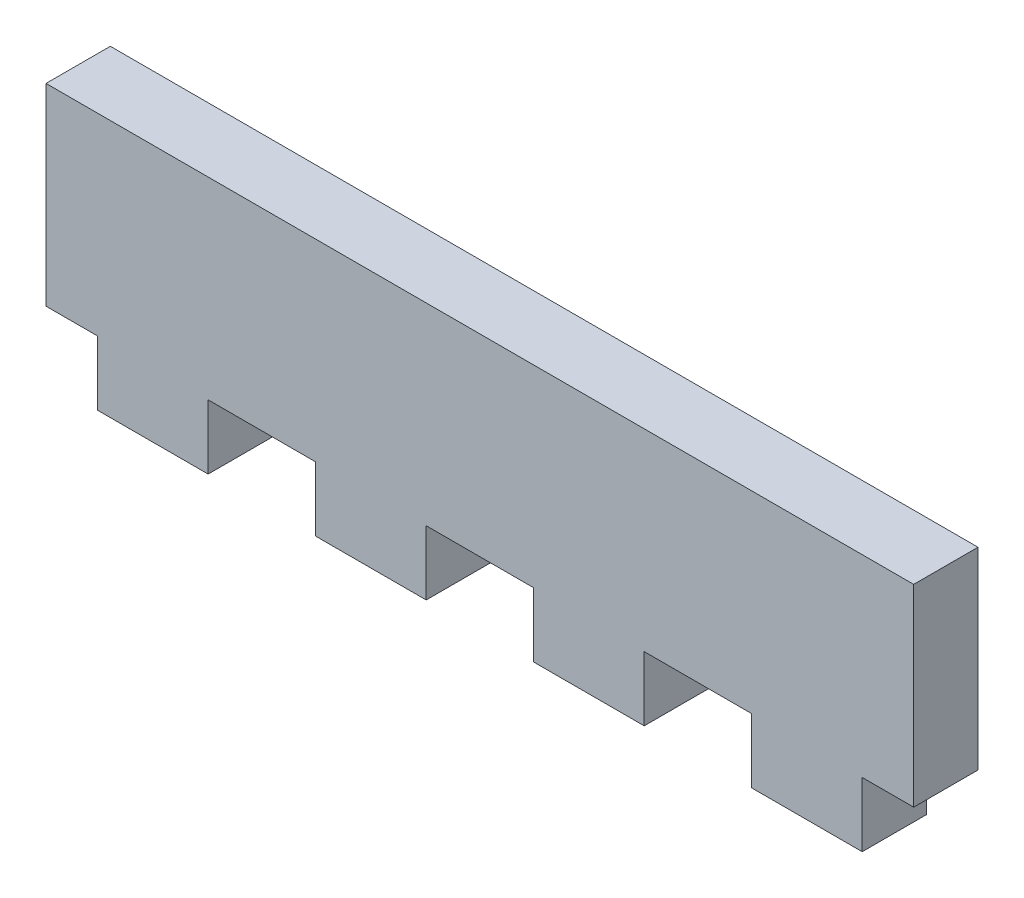
ISO-10303-21;
HEADER;
FILE_DESCRIPTION(('STEP AP214'),'2;1');
FILE_NAME('part.step','',(''),(''),'','','');
FILE_SCHEMA(('AUTOMOTIVE_DESIGN { 1 0 10303 214 1 1 1 1 }'));
ENDSEC;
DATA;
#1=APPLICATION_CONTEXT('core data for automotive mechanical design processes');
#2=APPLICATION_PROTOCOL_DEFINITION('international standard','automotive_design',2000,#1);
#3=PRODUCT_CONTEXT('',#1,'mechanical');
#4=PRODUCT('Part','Part','',(#3));
#5=PRODUCT_RELATED_PRODUCT_CATEGORY('part','',(#4));
#6=PRODUCT_DEFINITION_FORMATION('','',#4);
#7=PRODUCT_DEFINITION_CONTEXT('part definition',#1,'design');
#8=PRODUCT_DEFINITION('design','',#6,#7);
#9=PRODUCT_DEFINITION_SHAPE('','',#8);
#10=(LENGTH_UNIT() NAMED_UNIT(*) SI_UNIT(.MILLI.,.METRE.));
#11=(NAMED_UNIT(*) PLANE_ANGLE_UNIT() SI_UNIT($,.RADIAN.));
#12=(NAMED_UNIT(*) SI_UNIT($,.STERADIAN.) SOLID_ANGLE_UNIT());
#13=UNCERTAINTY_MEASURE_WITH_UNIT(LENGTH_MEASURE(1.E-05),#10,'distance_accuracy_value','');
#14=(GEOMETRIC_REPRESENTATION_CONTEXT(3) GLOBAL_UNCERTAINTY_ASSIGNED_CONTEXT((#13)) GLOBAL_UNIT_ASSIGNED_CONTEXT((#10,
#11,#12)) REPRESENTATION_CONTEXT('',''));
#15=CARTESIAN_POINT('',(0.,0.,0.));
#16=DIRECTION('',(0.,0.,1.));
#17=DIRECTION('',(1.,0.,0.));
#18=AXIS2_PLACEMENT_3D('',#15,#16,#17);
#19=CARTESIAN_POINT('',(5.73563581751116,29.8611746767434,5.));
#20=DIRECTION('',(-1.,0.,0.));
#21=DIRECTION('',(0.,0.,1.));
#22=AXIS2_PLACEMENT_3D('',#19,#20,#21);
#23=PLANE('',#22);
#24=DIRECTION('',(0.,1.,0.));
#25=VECTOR('',#24,1.);
#26=CARTESIAN_POINT('',(5.73563581751116,29.8611746767434,0.));
#27=LINE('',#26,#25);
#28=CARTESIAN_POINT('',(5.73563581751116,29.8611746767434,0.));
#29=VERTEX_POINT('',#28);
#30=CARTESIAN_POINT('',(5.73563581751116,34.8611746767434,0.));
#31=VERTEX_POINT('',#30);
#32=EDGE_CURVE('E200',#29,#31,#27,.T.);
#33=ORIENTED_EDGE('',*,*,#32,.T.);
#34=DIRECTION('',(0.,0.,-1.));
#35=VECTOR('',#34,1.);
#36=CARTESIAN_POINT('',(5.73563581751116,34.8611746767434,5.));
#37=LINE('',#36,#35);
#38=CARTESIAN_POINT('',(5.73563581751116,34.8611746767434,5.));
#39=VERTEX_POINT('',#38);
#40=EDGE_CURVE('E11',#39,#31,#37,.T.);
#41=ORIENTED_EDGE('',*,*,#40,.F.);
#42=DIRECTION('',(0.,1.,0.));
#43=VECTOR('',#42,1.);
#44=CARTESIAN_POINT('',(5.73563581751116,29.8611746767434,5.));
#45=LINE('',#44,#43);
#46=CARTESIAN_POINT('',(5.73563581751116,29.8611746767434,5.));
#47=VERTEX_POINT('',#46);
#48=EDGE_CURVE('E238',#47,#39,#45,.T.);
#49=ORIENTED_EDGE('',*,*,#48,.F.);
#50=DIRECTION('',(0.,0.,-1.));
#51=VECTOR('',#50,1.);
#52=CARTESIAN_POINT('',(5.73563581751116,29.8611746767434,5.));
#53=LINE('',#52,#51);
#54=EDGE_CURVE('E196',#47,#29,#53,.T.);
#55=ORIENTED_EDGE('',*,*,#54,.T.);
#56=EDGE_LOOP('',(#33,#41,#49,#55));
#57=FACE_BOUND('',#56,.T.);
#58=ADVANCED_FACE('F32',(#57),#23,.F.);
#59=CARTESIAN_POINT('',(5.73563581751116,34.8611746767434,5.));
#60=DIRECTION('',(0.,1.,0.));
#61=DIRECTION('',(0.,0.,1.));
#62=AXIS2_PLACEMENT_3D('',#59,#60,#61);
#63=PLANE('',#62);
#64=DIRECTION('',(1.,0.,0.));
#65=VECTOR('',#64,1.);
#66=CARTESIAN_POINT('',(5.73563581751116,34.8611746767434,0.));
#67=LINE('',#66,#65);
#68=CARTESIAN_POINT('',(14.0824358175112,34.8611746767434,0.));
#69=VERTEX_POINT('',#68);
#70=EDGE_CURVE('E203',#31,#69,#67,.T.);
#71=ORIENTED_EDGE('',*,*,#70,.T.);
#72=DIRECTION('',(0.,0.,-1.));
#73=VECTOR('',#72,1.);
#74=CARTESIAN_POINT('',(14.0824358175112,34.8611746767434,5.));
#75=LINE('',#74,#73);
#76=CARTESIAN_POINT('',(14.0824358175112,34.8611746767434,5.));
#77=VERTEX_POINT('',#76);
#78=EDGE_CURVE('E40',#77,#69,#75,.T.);
#79=ORIENTED_EDGE('',*,*,#78,.F.);
#80=DIRECTION('',(1.,0.,0.));
#81=VECTOR('',#80,1.);
#82=CARTESIAN_POINT('',(5.73563581751116,34.8611746767434,5.));
#83=LINE('',#82,#81);
#84=EDGE_CURVE('E127',#39,#77,#83,.T.);
#85=ORIENTED_EDGE('',*,*,#84,.F.);
#86=ORIENTED_EDGE('',*,*,#40,.T.);
#87=EDGE_LOOP('',(#71,#79,#85,#86));
#88=FACE_BOUND('',#87,.T.);
#89=ADVANCED_FACE('F356',(#88),#63,.F.);
#90=CARTESIAN_POINT('',(14.0824358175112,34.8611746767434,5.));
#91=DIRECTION('',(1.,0.,0.));
#92=DIRECTION('',(0.,0.,-1.));
#93=AXIS2_PLACEMENT_3D('',#90,#91,#92);
#94=PLANE('',#93);
#95=DIRECTION('',(0.,-1.,0.));
#96=VECTOR('',#95,1.);
#97=CARTESIAN_POINT('',(14.0824358175112,34.8611746767434,0.));
#98=LINE('',#97,#96);
#99=CARTESIAN_POINT('',(14.0824358175112,29.8611746767434,0.));
#100=VERTEX_POINT('',#99);
#101=EDGE_CURVE('E205',#69,#100,#98,.T.);
#102=ORIENTED_EDGE('',*,*,#101,.T.);
#103=DIRECTION('',(0.,0.,-1.));
#104=VECTOR('',#103,1.);
#105=CARTESIAN_POINT('',(14.0824358175112,29.8611746767434,5.));
#106=LINE('',#105,#104);
#107=CARTESIAN_POINT('',(14.0824358175112,29.8611746767434,5.));
#108=VERTEX_POINT('',#107);
#109=EDGE_CURVE('E281',#108,#100,#106,.T.);
#110=ORIENTED_EDGE('',*,*,#109,.F.);
#111=DIRECTION('',(0.,-1.,0.));
#112=VECTOR('',#111,1.);
#113=CARTESIAN_POINT('',(14.0824358175112,34.8611746767434,5.));
#114=LINE('',#113,#112);
#115=EDGE_CURVE('E289',#77,#108,#114,.T.);
#116=ORIENTED_EDGE('',*,*,#115,.F.);
#117=ORIENTED_EDGE('',*,*,#78,.T.);
#118=EDGE_LOOP('',(#102,#110,#116,#117));
#119=FACE_BOUND('',#118,.T.);
#120=ADVANCED_FACE('F287',(#119),#94,.F.);
#121=CARTESIAN_POINT('',(22.6831358175112,29.8611746767434,5.));
#122=DIRECTION('',(0.,1.,0.));
#123=DIRECTION('',(0.,0.,1.));
#124=AXIS2_PLACEMENT_3D('',#121,#122,#123);
#125=PLANE('',#124);
#126=DIRECTION('',(1.,0.,0.));
#127=VECTOR('',#126,1.);
#128=CARTESIAN_POINT('',(22.6831358175112,29.8611746767434,0.));
#129=LINE('',#128,#127);
#130=CARTESIAN_POINT('',(22.6831358175112,29.8611746767434,0.));
#131=VERTEX_POINT('',#130);
#132=EDGE_CURVE('E207',#100,#131,#129,.T.);
#133=ORIENTED_EDGE('',*,*,#132,.T.);
#134=DIRECTION('',(0.,0.,-1.));
#135=VECTOR('',#134,1.);
#136=CARTESIAN_POINT('',(22.6831358175112,29.8611746767434,5.));
#137=LINE('',#136,#135);
#138=CARTESIAN_POINT('',(22.6831358175112,29.8611746767434,5.));
#139=VERTEX_POINT('',#138);
#140=EDGE_CURVE('E278',#139,#131,#137,.T.);
#141=ORIENTED_EDGE('',*,*,#140,.F.);
#142=DIRECTION('',(1.,0.,0.));
#143=VECTOR('',#142,1.);
#144=CARTESIAN_POINT('',(22.6831358175112,29.8611746767434,5.));
#145=LINE('',#144,#143);
#146=EDGE_CURVE('E307',#108,#139,#145,.T.);
#147=ORIENTED_EDGE('',*,*,#146,.F.);
#148=ORIENTED_EDGE('',*,*,#109,.T.);
#149=EDGE_LOOP('',(#133,#141,#147,#148));
#150=FACE_BOUND('',#149,.T.);
#151=ADVANCED_FACE('F298',(#150),#125,.F.);
#152=CARTESIAN_POINT('',(22.6831358175112,29.8611746767434,5.));
#153=DIRECTION('',(-1.,0.,0.));
#154=DIRECTION('',(0.,0.,1.));
#155=AXIS2_PLACEMENT_3D('',#152,#153,#154);
#156=PLANE('',#155);
#157=DIRECTION('',(0.,1.,0.));
#158=VECTOR('',#157,1.);
#159=CARTESIAN_POINT('',(22.6831358175112,29.8611746767434,0.));
#160=LINE('',#159,#158);
#161=CARTESIAN_POINT('',(22.6831358175112,34.8611746767434,0.));
#162=VERTEX_POINT('',#161);
#163=EDGE_CURVE('E209',#131,#162,#160,.T.);
#164=ORIENTED_EDGE('',*,*,#163,.T.);
#165=DIRECTION('',(0.,0.,-1.));
#166=VECTOR('',#165,1.);
#167=CARTESIAN_POINT('',(22.6831358175112,34.8611746767434,5.));
#168=LINE('',#167,#166);
#169=CARTESIAN_POINT('',(22.6831358175112,34.8611746767434,5.));
#170=VERTEX_POINT('',#169);
#171=EDGE_CURVE('E275',#170,#162,#168,.T.);
#172=ORIENTED_EDGE('',*,*,#171,.F.);
#173=DIRECTION('',(0.,1.,0.));
#174=VECTOR('',#173,1.);
#175=CARTESIAN_POINT('',(22.6831358175112,29.8611746767434,5.));
#176=LINE('',#175,#174);
#177=EDGE_CURVE('E304',#139,#170,#176,.T.);
#178=ORIENTED_EDGE('',*,*,#177,.F.);
#179=ORIENTED_EDGE('',*,*,#140,.T.);
#180=EDGE_LOOP('',(#164,#172,#178,#179));
#181=FACE_BOUND('',#180,.T.);
#182=ADVANCED_FACE('F302',(#181),#156,.F.);
#183=CARTESIAN_POINT('',(22.6831358175112,34.8611746767434,5.));
#184=DIRECTION('',(0.,1.,0.));
#185=DIRECTION('',(0.,0.,1.));
#186=AXIS2_PLACEMENT_3D('',#183,#184,#185);
#187=PLANE('',#186);
#188=DIRECTION('',(1.,0.,0.));
#189=VECTOR('',#188,1.);
#190=CARTESIAN_POINT('',(22.6831358175112,34.8611746767434,0.));
#191=LINE('',#190,#189);
#192=CARTESIAN_POINT('',(26.6831358175112,34.8611746767434,0.));
#193=VERTEX_POINT('',#192);
#194=EDGE_CURVE('E211',#162,#193,#191,.T.);
#195=ORIENTED_EDGE('',*,*,#194,.T.);
#196=DIRECTION('',(0.,0.,-1.));
#197=VECTOR('',#196,1.);
#198=CARTESIAN_POINT('',(26.6831358175112,34.8611746767434,5.));
#199=LINE('',#198,#197);
#200=CARTESIAN_POINT('',(26.6831358175112,34.8611746767434,5.));
#201=VERTEX_POINT('',#200);
#202=EDGE_CURVE('E272',#201,#193,#199,.T.);
#203=ORIENTED_EDGE('',*,*,#202,.F.);
#204=DIRECTION('',(1.,0.,0.));
#205=VECTOR('',#204,1.);
#206=CARTESIAN_POINT('',(22.6831358175112,34.8611746767434,5.));
#207=LINE('',#206,#205);
#208=EDGE_CURVE('E306',#170,#201,#207,.T.);
#209=ORIENTED_EDGE('',*,*,#208,.F.);
#210=ORIENTED_EDGE('',*,*,#171,.T.);
#211=EDGE_LOOP('',(#195,#203,#209,#210));
#212=FACE_BOUND('',#211,.T.);
#213=ADVANCED_FACE('F369',(#212),#187,.F.);
#214=CARTESIAN_POINT('',(26.6831358175112,34.8611746767434,5.));
#215=DIRECTION('',(-1.,0.,0.));
#216=DIRECTION('',(0.,0.,1.));
#217=AXIS2_PLACEMENT_3D('',#214,#215,#216);
#218=PLANE('',#217);
#219=DIRECTION('',(0.,1.,0.));
#220=VECTOR('',#219,1.);
#221=CARTESIAN_POINT('',(26.6831358175112,34.8611746767434,0.));
#222=LINE('',#221,#220);
#223=CARTESIAN_POINT('',(26.6831358175112,49.8611746767434,0.));
#224=VERTEX_POINT('',#223);
#225=EDGE_CURVE('E213',#193,#224,#222,.T.);
#226=ORIENTED_EDGE('',*,*,#225,.T.);
#227=DIRECTION('',(0.,0.,-1.));
#228=VECTOR('',#227,1.);
#229=CARTESIAN_POINT('',(26.6831358175112,49.8611746767434,5.));
#230=LINE('',#229,#228);
#231=CARTESIAN_POINT('',(26.6831358175112,49.8611746767434,5.));
#232=VERTEX_POINT('',#231);
#233=EDGE_CURVE('E269',#232,#224,#230,.T.);
#234=ORIENTED_EDGE('',*,*,#233,.F.);
#235=DIRECTION('',(0.,1.,0.));
#236=VECTOR('',#235,1.);
#237=CARTESIAN_POINT('',(26.6831358175112,34.8611746767434,5.));
#238=LINE('',#237,#236);
#239=EDGE_CURVE('E309',#201,#232,#238,.T.);
#240=ORIENTED_EDGE('',*,*,#239,.F.);
#241=ORIENTED_EDGE('',*,*,#202,.T.);
#242=EDGE_LOOP('',(#226,#234,#240,#241));
#243=FACE_BOUND('',#242,.T.);
#244=ADVANCED_FACE('F372',(#243),#218,.F.);
#245=CARTESIAN_POINT('',(26.6831358175112,49.8611746767434,5.));
#246=DIRECTION('',(0.,-1.,0.));
#247=DIRECTION('',(1.,0.,0.));
#248=AXIS2_PLACEMENT_3D('',#245,#246,#247);
#249=PLANE('',#248);
#250=DIRECTION('',(-1.,0.,0.));
#251=VECTOR('',#250,1.);
#252=CARTESIAN_POINT('',(26.6831358175112,49.8611746767434,0.));
#253=LINE('',#252,#251);
#254=CARTESIAN_POINT('',(-40.7670641824889,49.8611746767434,0.));
#255=VERTEX_POINT('',#254);
#256=EDGE_CURVE('E215',#224,#255,#253,.T.);
#257=ORIENTED_EDGE('',*,*,#256,.T.);
#258=DIRECTION('',(0.,0.,-1.));
#259=VECTOR('',#258,1.);
#260=CARTESIAN_POINT('',(-40.7670641824889,49.8611746767434,5.));
#261=LINE('',#260,#259);
#262=CARTESIAN_POINT('',(-40.7670641824889,49.8611746767434,5.));
#263=VERTEX_POINT('',#262);
#264=EDGE_CURVE('E266',#263,#255,#261,.T.);
#265=ORIENTED_EDGE('',*,*,#264,.F.);
#266=DIRECTION('',(-1.,0.,0.));
#267=VECTOR('',#266,1.);
#268=CARTESIAN_POINT('',(26.6831358175112,49.8611746767434,5.));
#269=LINE('',#268,#267);
#270=EDGE_CURVE('E315',#232,#263,#269,.T.);
#271=ORIENTED_EDGE('',*,*,#270,.F.);
#272=ORIENTED_EDGE('',*,*,#233,.T.);
#273=EDGE_LOOP('',(#257,#265,#271,#272));
#274=FACE_BOUND('',#273,.T.);
#275=ADVANCED_FACE('F376',(#274),#249,.F.);
#276=CARTESIAN_POINT('',(-40.7670641824889,34.8611746767434,5.));
#277=DIRECTION('',(1.,0.,0.));
#278=DIRECTION('',(0.,0.,-1.));
#279=AXIS2_PLACEMENT_3D('',#276,#277,#278);
#280=PLANE('',#279);
#281=DIRECTION('',(0.,-1.,0.));
#282=VECTOR('',#281,1.);
#283=CARTESIAN_POINT('',(-40.7670641824889,34.8611746767434,0.));
#284=LINE('',#283,#282);
#285=CARTESIAN_POINT('',(-40.7670641824889,34.8611746767434,0.));
#286=VERTEX_POINT('',#285);
#287=EDGE_CURVE('E217',#255,#286,#284,.T.);
#288=ORIENTED_EDGE('',*,*,#287,.T.);
#289=DIRECTION('',(0.,0.,-1.));
#290=VECTOR('',#289,1.);
#291=CARTESIAN_POINT('',(-40.7670641824889,34.8611746767434,5.));
#292=LINE('',#291,#290);
#293=CARTESIAN_POINT('',(-40.7670641824889,34.8611746767434,5.));
#294=VERTEX_POINT('',#293);
#295=EDGE_CURVE('E263',#294,#286,#292,.T.);
#296=ORIENTED_EDGE('',*,*,#295,.F.);
#297=DIRECTION('',(0.,-1.,0.));
#298=VECTOR('',#297,1.);
#299=CARTESIAN_POINT('',(-40.7670641824889,34.8611746767434,5.));
#300=LINE('',#299,#298);
#301=EDGE_CURVE('E317',#263,#294,#300,.T.);
#302=ORIENTED_EDGE('',*,*,#301,.F.);
#303=ORIENTED_EDGE('',*,*,#264,.T.);
#304=EDGE_LOOP('',(#288,#296,#302,#303));
#305=FACE_BOUND('',#304,.T.);
#306=ADVANCED_FACE('F380',(#305),#280,.F.);
#307=CARTESIAN_POINT('',(-36.7670641824889,34.8611746767434,5.));
#308=DIRECTION('',(0.,1.,0.));
#309=DIRECTION('',(0.,0.,1.));
#310=AXIS2_PLACEMENT_3D('',#307,#308,#309);
#311=PLANE('',#310);
#312=DIRECTION('',(1.,0.,0.));
#313=VECTOR('',#312,1.);
#314=CARTESIAN_POINT('',(-36.7670641824889,34.8611746767434,0.));
#315=LINE('',#314,#313);
#316=CARTESIAN_POINT('',(-36.7670641824889,34.8611746767434,0.));
#317=VERTEX_POINT('',#316);
#318=EDGE_CURVE('E219',#286,#317,#315,.T.);
#319=ORIENTED_EDGE('',*,*,#318,.T.);
#320=DIRECTION('',(0.,0.,-1.));
#321=VECTOR('',#320,1.);
#322=CARTESIAN_POINT('',(-36.7670641824889,34.8611746767434,5.));
#323=LINE('',#322,#321);
#324=CARTESIAN_POINT('',(-36.7670641824889,34.8611746767434,5.));
#325=VERTEX_POINT('',#324);
#326=EDGE_CURVE('E260',#325,#317,#323,.T.);
#327=ORIENTED_EDGE('',*,*,#326,.F.);
#328=DIRECTION('',(1.,0.,0.));
#329=VECTOR('',#328,1.);
#330=CARTESIAN_POINT('',(-36.7670641824889,34.8611746767434,5.));
#331=LINE('',#330,#329);
#332=EDGE_CURVE('E319',#294,#325,#331,.T.);
#333=ORIENTED_EDGE('',*,*,#332,.F.);
#334=ORIENTED_EDGE('',*,*,#295,.T.);
#335=EDGE_LOOP('',(#319,#327,#333,#334));
#336=FACE_BOUND('',#335,.T.);
#337=ADVANCED_FACE('F384',(#336),#311,.F.);
#338=CARTESIAN_POINT('',(-36.7670641824889,29.8611746767434,5.));
#339=DIRECTION('',(1.,0.,0.));
#340=DIRECTION('',(0.,0.,-1.));
#341=AXIS2_PLACEMENT_3D('',#338,#339,#340);
#342=PLANE('',#341);
#343=DIRECTION('',(0.,-1.,0.));
#344=VECTOR('',#343,1.);
#345=CARTESIAN_POINT('',(-36.7670641824889,29.8611746767434,0.));
#346=LINE('',#345,#344);
#347=CARTESIAN_POINT('',(-36.7670641824889,29.8611746767434,0.));
#348=VERTEX_POINT('',#347);
#349=EDGE_CURVE('E221',#317,#348,#346,.T.);
#350=ORIENTED_EDGE('',*,*,#349,.T.);
#351=DIRECTION('',(0.,0.,-1.));
#352=VECTOR('',#351,1.);
#353=CARTESIAN_POINT('',(-36.7670641824889,29.8611746767434,5.));
#354=LINE('',#353,#352);
#355=CARTESIAN_POINT('',(-36.7670641824889,29.8611746767434,5.));
#356=VERTEX_POINT('',#355);
#357=EDGE_CURVE('E257',#356,#348,#354,.T.);
#358=ORIENTED_EDGE('',*,*,#357,.F.);
#359=DIRECTION('',(0.,-1.,0.));
#360=VECTOR('',#359,1.);
#361=CARTESIAN_POINT('',(-36.7670641824889,29.8611746767434,5.));
#362=LINE('',#361,#360);
#363=EDGE_CURVE('E321',#325,#356,#362,.T.);
#364=ORIENTED_EDGE('',*,*,#363,.F.);
#365=ORIENTED_EDGE('',*,*,#326,.T.);
#366=EDGE_LOOP('',(#350,#358,#364,#365));
#367=FACE_BOUND('',#366,.T.);
#368=ADVANCED_FACE('F388',(#367),#342,.F.);
#369=CARTESIAN_POINT('',(-28.1627641824889,29.8611746767434,5.));
#370=DIRECTION('',(0.,1.,0.));
#371=DIRECTION('',(0.,0.,1.));
#372=AXIS2_PLACEMENT_3D('',#369,#370,#371);
#373=PLANE('',#372);
#374=DIRECTION('',(1.,0.,0.));
#375=VECTOR('',#374,1.);
#376=CARTESIAN_POINT('',(-28.1627641824889,29.8611746767434,0.));
#377=LINE('',#376,#375);
#378=CARTESIAN_POINT('',(-28.1627641824889,29.8611746767434,0.));
#379=VERTEX_POINT('',#378);
#380=EDGE_CURVE('E223',#348,#379,#377,.T.);
#381=ORIENTED_EDGE('',*,*,#380,.T.);
#382=DIRECTION('',(0.,0.,-1.));
#383=VECTOR('',#382,1.);
#384=CARTESIAN_POINT('',(-28.1627641824889,29.8611746767434,5.));
#385=LINE('',#384,#383);
#386=CARTESIAN_POINT('',(-28.1627641824889,29.8611746767434,5.));
#387=VERTEX_POINT('',#386);
#388=EDGE_CURVE('E254',#387,#379,#385,.T.);
#389=ORIENTED_EDGE('',*,*,#388,.F.);
#390=DIRECTION('',(1.,0.,0.));
#391=VECTOR('',#390,1.);
#392=CARTESIAN_POINT('',(-28.1627641824889,29.8611746767434,5.));
#393=LINE('',#392,#391);
#394=EDGE_CURVE('E323',#356,#387,#393,.T.);
#395=ORIENTED_EDGE('',*,*,#394,.F.);
#396=ORIENTED_EDGE('',*,*,#357,.T.);
#397=EDGE_LOOP('',(#381,#389,#395,#396));
#398=FACE_BOUND('',#397,.T.);
#399=ADVANCED_FACE('F392',(#398),#373,.F.);
#400=CARTESIAN_POINT('',(-28.1627641824889,29.8611746767434,5.));
#401=DIRECTION('',(-1.,0.,0.));
#402=DIRECTION('',(0.,0.,1.));
#403=AXIS2_PLACEMENT_3D('',#400,#401,#402);
#404=PLANE('',#403);
#405=DIRECTION('',(0.,1.,0.));
#406=VECTOR('',#405,1.);
#407=CARTESIAN_POINT('',(-28.1627641824889,29.8611746767434,0.));
#408=LINE('',#407,#406);
#409=CARTESIAN_POINT('',(-28.1627641824889,34.8611746767434,0.));
#410=VERTEX_POINT('',#409);
#411=EDGE_CURVE('E225',#379,#410,#408,.T.);
#412=ORIENTED_EDGE('',*,*,#411,.T.);
#413=DIRECTION('',(0.,0.,-1.));
#414=VECTOR('',#413,1.);
#415=CARTESIAN_POINT('',(-28.1627641824889,34.8611746767434,5.));
#416=LINE('',#415,#414);
#417=CARTESIAN_POINT('',(-28.1627641824889,34.8611746767434,5.));
#418=VERTEX_POINT('',#417);
#419=EDGE_CURVE('E251',#418,#410,#416,.T.);
#420=ORIENTED_EDGE('',*,*,#419,.F.);
#421=DIRECTION('',(0.,1.,0.));
#422=VECTOR('',#421,1.);
#423=CARTESIAN_POINT('',(-28.1627641824889,29.8611746767434,5.));
#424=LINE('',#423,#422);
#425=EDGE_CURVE('E325',#387,#418,#424,.T.);
#426=ORIENTED_EDGE('',*,*,#425,.F.);
#427=ORIENTED_EDGE('',*,*,#388,.T.);
#428=EDGE_LOOP('',(#412,#420,#426,#427));
#429=FACE_BOUND('',#428,.T.);
#430=ADVANCED_FACE('F396',(#429),#404,.F.);
#431=CARTESIAN_POINT('',(-19.8160641824889,34.8611746767434,5.));
#432=DIRECTION('',(0.,1.,0.));
#433=DIRECTION('',(0.,0.,1.));
#434=AXIS2_PLACEMENT_3D('',#431,#432,#433);
#435=PLANE('',#434);
#436=DIRECTION('',(1.,0.,0.));
#437=VECTOR('',#436,1.);
#438=CARTESIAN_POINT('',(-19.8160641824889,34.8611746767434,0.));
#439=LINE('',#438,#437);
#440=CARTESIAN_POINT('',(-19.8160641824889,34.8611746767434,0.));
#441=VERTEX_POINT('',#440);
#442=EDGE_CURVE('E227',#410,#441,#439,.T.);
#443=ORIENTED_EDGE('',*,*,#442,.T.);
#444=DIRECTION('',(0.,0.,-1.));
#445=VECTOR('',#444,1.);
#446=CARTESIAN_POINT('',(-19.8160641824889,34.8611746767434,5.));
#447=LINE('',#446,#445);
#448=CARTESIAN_POINT('',(-19.8160641824889,34.8611746767434,5.));
#449=VERTEX_POINT('',#448);
#450=EDGE_CURVE('E248',#449,#441,#447,.T.);
#451=ORIENTED_EDGE('',*,*,#450,.F.);
#452=DIRECTION('',(1.,0.,0.));
#453=VECTOR('',#452,1.);
#454=CARTESIAN_POINT('',(-19.8160641824889,34.8611746767434,5.));
#455=LINE('',#454,#453);
#456=EDGE_CURVE('E327',#418,#449,#455,.T.);
#457=ORIENTED_EDGE('',*,*,#456,.F.);
#458=ORIENTED_EDGE('',*,*,#419,.T.);
#459=EDGE_LOOP('',(#443,#451,#457,#458));
#460=FACE_BOUND('',#459,.T.);
#461=ADVANCED_FACE('F400',(#460),#435,.F.);
#462=CARTESIAN_POINT('',(-19.8160641824889,29.8611746767434,5.));
#463=DIRECTION('',(1.,0.,0.));
#464=DIRECTION('',(0.,0.,-1.));
#465=AXIS2_PLACEMENT_3D('',#462,#463,#464);
#466=PLANE('',#465);
#467=DIRECTION('',(0.,-1.,0.));
#468=VECTOR('',#467,1.);
#469=CARTESIAN_POINT('',(-19.8160641824889,29.8611746767434,0.));
#470=LINE('',#469,#468);
#471=CARTESIAN_POINT('',(-19.8160641824889,29.8611746767434,0.));
#472=VERTEX_POINT('',#471);
#473=EDGE_CURVE('E229',#441,#472,#470,.T.);
#474=ORIENTED_EDGE('',*,*,#473,.T.);
#475=DIRECTION('',(0.,0.,-1.));
#476=VECTOR('',#475,1.);
#477=CARTESIAN_POINT('',(-19.8160641824889,29.8611746767434,5.));
#478=LINE('',#477,#476);
#479=CARTESIAN_POINT('',(-19.8160641824889,29.8611746767434,5.));
#480=VERTEX_POINT('',#479);
#481=EDGE_CURVE('E245',#480,#472,#478,.T.);
#482=ORIENTED_EDGE('',*,*,#481,.F.);
#483=DIRECTION('',(0.,-1.,0.));
#484=VECTOR('',#483,1.);
#485=CARTESIAN_POINT('',(-19.8160641824889,29.8611746767434,5.));
#486=LINE('',#485,#484);
#487=EDGE_CURVE('E329',#449,#480,#486,.T.);
#488=ORIENTED_EDGE('',*,*,#487,.F.);
#489=ORIENTED_EDGE('',*,*,#450,.T.);
#490=EDGE_LOOP('',(#474,#482,#488,#489));
#491=FACE_BOUND('',#490,.T.);
#492=ADVANCED_FACE('F404',(#491),#466,.F.);
#493=CARTESIAN_POINT('',(-11.2118641824889,29.8611746767434,5.));
#494=DIRECTION('',(0.,1.,0.));
#495=DIRECTION('',(0.,0.,1.));
#496=AXIS2_PLACEMENT_3D('',#493,#494,#495);
#497=PLANE('',#496);
#498=DIRECTION('',(1.,0.,0.));
#499=VECTOR('',#498,1.);
#500=CARTESIAN_POINT('',(-11.2118641824889,29.8611746767434,0.));
#501=LINE('',#500,#499);
#502=CARTESIAN_POINT('',(-11.2118641824889,29.8611746767434,0.));
#503=VERTEX_POINT('',#502);
#504=EDGE_CURVE('E231',#472,#503,#501,.T.);
#505=ORIENTED_EDGE('',*,*,#504,.T.);
#506=DIRECTION('',(0.,0.,-1.));
#507=VECTOR('',#506,1.);
#508=CARTESIAN_POINT('',(-11.2118641824889,29.8611746767434,5.));
#509=LINE('',#508,#507);
#510=CARTESIAN_POINT('',(-11.2118641824889,29.8611746767434,5.));
#511=VERTEX_POINT('',#510);
#512=EDGE_CURVE('E242',#511,#503,#509,.T.);
#513=ORIENTED_EDGE('',*,*,#512,.F.);
#514=DIRECTION('',(1.,0.,0.));
#515=VECTOR('',#514,1.);
#516=CARTESIAN_POINT('',(-11.2118641824889,29.8611746767434,5.));
#517=LINE('',#516,#515);
#518=EDGE_CURVE('E331',#480,#511,#517,.T.);
#519=ORIENTED_EDGE('',*,*,#518,.F.);
#520=ORIENTED_EDGE('',*,*,#481,.T.);
#521=EDGE_LOOP('',(#505,#513,#519,#520));
#522=FACE_BOUND('',#521,.T.);
#523=ADVANCED_FACE('F337',(#522),#497,.F.);
#524=CARTESIAN_POINT('',(-11.2118641824889,29.8611746767434,5.));
#525=DIRECTION('',(-1.,0.,0.));
#526=DIRECTION('',(0.,0.,1.));
#527=AXIS2_PLACEMENT_3D('',#524,#525,#526);
#528=PLANE('',#527);
#529=DIRECTION('',(0.,1.,0.));
#530=VECTOR('',#529,1.);
#531=CARTESIAN_POINT('',(-11.2118641824889,29.8611746767434,0.));
#532=LINE('',#531,#530);
#533=CARTESIAN_POINT('',(-11.2118641824889,34.8611746767434,0.));
#534=VERTEX_POINT('',#533);
#535=EDGE_CURVE('E233',#503,#534,#532,.T.);
#536=ORIENTED_EDGE('',*,*,#535,.T.);
#537=DIRECTION('',(0.,0.,-1.));
#538=VECTOR('',#537,1.);
#539=CARTESIAN_POINT('',(-11.2118641824889,34.8611746767434,5.));
#540=LINE('',#539,#538);
#541=CARTESIAN_POINT('',(-11.2118641824889,34.8611746767434,5.));
#542=VERTEX_POINT('',#541);
#543=EDGE_CURVE('E191',#542,#534,#540,.T.);
#544=ORIENTED_EDGE('',*,*,#543,.F.);
#545=DIRECTION('',(0.,1.,0.));
#546=VECTOR('',#545,1.);
#547=CARTESIAN_POINT('',(-11.2118641824889,29.8611746767434,5.));
#548=LINE('',#547,#546);
#549=EDGE_CURVE('E182',#511,#542,#548,.T.);
#550=ORIENTED_EDGE('',*,*,#549,.F.);
#551=ORIENTED_EDGE('',*,*,#512,.T.);
#552=EDGE_LOOP('',(#536,#544,#550,#551));
#553=FACE_BOUND('',#552,.T.);
#554=ADVANCED_FACE('F341',(#553),#528,.F.);
#555=CARTESIAN_POINT('',(-11.2118641824889,34.8611746767434,5.));
#556=DIRECTION('',(0.,1.,0.));
#557=DIRECTION('',(0.,0.,1.));
#558=AXIS2_PLACEMENT_3D('',#555,#556,#557);
#559=PLANE('',#558);
#560=DIRECTION('',(1.,0.,0.));
#561=VECTOR('',#560,1.);
#562=CARTESIAN_POINT('',(-11.2118641824889,34.8611746767434,0.));
#563=LINE('',#562,#561);
#564=CARTESIAN_POINT('',(-2.86506418248886,34.8611746767434,0.));
#565=VERTEX_POINT('',#564);
#566=EDGE_CURVE('E190',#534,#565,#563,.T.);
#567=ORIENTED_EDGE('',*,*,#566,.T.);
#568=DIRECTION('',(0.,0.,-1.));
#569=VECTOR('',#568,1.);
#570=CARTESIAN_POINT('',(-2.86506418248886,34.8611746767434,5.));
#571=LINE('',#570,#569);
#572=CARTESIAN_POINT('',(-2.86506418248886,34.8611746767434,5.));
#573=VERTEX_POINT('',#572);
#574=EDGE_CURVE('E187',#573,#565,#571,.T.);
#575=ORIENTED_EDGE('',*,*,#574,.F.);
#576=DIRECTION('',(1.,0.,0.));
#577=VECTOR('',#576,1.);
#578=CARTESIAN_POINT('',(-11.2118641824889,34.8611746767434,5.));
#579=LINE('',#578,#577);
#580=EDGE_CURVE('E176',#542,#573,#579,.T.);
#581=ORIENTED_EDGE('',*,*,#580,.F.);
#582=ORIENTED_EDGE('',*,*,#543,.T.);
#583=EDGE_LOOP('',(#567,#575,#581,#582));
#584=FACE_BOUND('',#583,.T.);
#585=ADVANCED_FACE('F188',(#584),#559,.F.);
#586=CARTESIAN_POINT('',(-2.86506418248886,34.8611746767434,5.));
#587=DIRECTION('',(1.,0.,0.));
#588=DIRECTION('',(0.,0.,-1.));
#589=AXIS2_PLACEMENT_3D('',#586,#587,#588);
#590=PLANE('',#589);
#591=DIRECTION('',(0.,-1.,0.));
#592=VECTOR('',#591,1.);
#593=CARTESIAN_POINT('',(-2.86506418248886,34.8611746767434,0.));
#594=LINE('',#593,#592);
#595=CARTESIAN_POINT('',(-2.86506418248886,29.8611746767434,0.));
#596=VERTEX_POINT('',#595);
#597=EDGE_CURVE('E113',#565,#596,#594,.T.);
#598=ORIENTED_EDGE('',*,*,#597,.T.);
#599=DIRECTION('',(0.,0.,-1.));
#600=VECTOR('',#599,1.);
#601=CARTESIAN_POINT('',(-2.86506418248886,29.8611746767434,5.));
#602=LINE('',#601,#600);
#603=CARTESIAN_POINT('',(-2.86506418248886,29.8611746767434,5.));
#604=VERTEX_POINT('',#603);
#605=EDGE_CURVE('E192',#604,#596,#602,.T.);
#606=ORIENTED_EDGE('',*,*,#605,.F.);
#607=DIRECTION('',(0.,-1.,0.));
#608=VECTOR('',#607,1.);
#609=CARTESIAN_POINT('',(-2.86506418248886,34.8611746767434,5.));
#610=LINE('',#609,#608);
#611=EDGE_CURVE('E180',#573,#604,#610,.T.);
#612=ORIENTED_EDGE('',*,*,#611,.F.);
#613=ORIENTED_EDGE('',*,*,#574,.T.);
#614=EDGE_LOOP('',(#598,#606,#612,#613));
#615=FACE_BOUND('',#614,.T.);
#616=ADVANCED_FACE('F194',(#615),#590,.F.);
#617=CARTESIAN_POINT('',(5.73563581751116,29.8611746767434,5.));
#618=DIRECTION('',(0.,1.,0.));
#619=DIRECTION('',(0.,0.,1.));
#620=AXIS2_PLACEMENT_3D('',#617,#618,#619);
#621=PLANE('',#620);
#622=DIRECTION('',(1.,0.,0.));
#623=VECTOR('',#622,1.);
#624=CARTESIAN_POINT('',(5.73563581751116,29.8611746767434,0.));
#625=LINE('',#624,#623);
#626=EDGE_CURVE('E119',#596,#29,#625,.T.);
#627=ORIENTED_EDGE('',*,*,#626,.T.);
#628=ORIENTED_EDGE('',*,*,#54,.F.);
#629=DIRECTION('',(1.,0.,0.));
#630=VECTOR('',#629,1.);
#631=CARTESIAN_POINT('',(5.73563581751116,29.8611746767434,5.));
#632=LINE('',#631,#630);
#633=EDGE_CURVE('E48',#604,#47,#632,.T.);
#634=ORIENTED_EDGE('',*,*,#633,.F.);
#635=ORIENTED_EDGE('',*,*,#605,.T.);
#636=EDGE_LOOP('',(#627,#628,#634,#635));
#637=FACE_BOUND('',#636,.T.);
#638=ADVANCED_FACE('F345',(#637),#621,.F.);
#639=CARTESIAN_POINT('',(0.,0.,5.));
#640=DIRECTION('',(0.,0.,-1.));
#641=DIRECTION('',(-1.,0.,0.));
#642=AXIS2_PLACEMENT_3D('',#639,#640,#641);
#643=PLANE('',#642);
#644=ORIENTED_EDGE('',*,*,#48,.T.);
#645=ORIENTED_EDGE('',*,*,#84,.T.);
#646=ORIENTED_EDGE('',*,*,#115,.T.);
#647=ORIENTED_EDGE('',*,*,#146,.T.);
#648=ORIENTED_EDGE('',*,*,#177,.T.);
#649=ORIENTED_EDGE('',*,*,#208,.T.);
#650=ORIENTED_EDGE('',*,*,#239,.T.);
#651=ORIENTED_EDGE('',*,*,#270,.T.);
#652=ORIENTED_EDGE('',*,*,#301,.T.);
#653=ORIENTED_EDGE('',*,*,#332,.T.);
#654=ORIENTED_EDGE('',*,*,#363,.T.);
#655=ORIENTED_EDGE('',*,*,#394,.T.);
#656=ORIENTED_EDGE('',*,*,#425,.T.);
#657=ORIENTED_EDGE('',*,*,#456,.T.);
#658=ORIENTED_EDGE('',*,*,#487,.T.);
#659=ORIENTED_EDGE('',*,*,#518,.T.);
#660=ORIENTED_EDGE('',*,*,#549,.T.);
#661=ORIENTED_EDGE('',*,*,#580,.T.);
#662=ORIENTED_EDGE('',*,*,#611,.T.);
#663=ORIENTED_EDGE('',*,*,#633,.T.);
#664=EDGE_LOOP('',(#644,#645,#646,#647,#648,#649,#650,#651,#652,#653,#654,#655,#656,#657,#658,
#659,#660,#661,#662,#663));
#665=FACE_BOUND('',#664,.T.);
#666=ADVANCED_FACE('F178',(#665),#643,.F.);
#667=CARTESIAN_POINT('',(0.,0.,0.));
#668=DIRECTION('',(0.,0.,-1.));
#669=DIRECTION('',(-1.,0.,0.));
#670=AXIS2_PLACEMENT_3D('',#667,#668,#669);
#671=PLANE('',#670);
#672=ORIENTED_EDGE('',*,*,#32,.F.);
#673=ORIENTED_EDGE('',*,*,#626,.F.);
#674=ORIENTED_EDGE('',*,*,#597,.F.);
#675=ORIENTED_EDGE('',*,*,#566,.F.);
#676=ORIENTED_EDGE('',*,*,#535,.F.);
#677=ORIENTED_EDGE('',*,*,#504,.F.);
#678=ORIENTED_EDGE('',*,*,#473,.F.);
#679=ORIENTED_EDGE('',*,*,#442,.F.);
#680=ORIENTED_EDGE('',*,*,#411,.F.);
#681=ORIENTED_EDGE('',*,*,#380,.F.);
#682=ORIENTED_EDGE('',*,*,#349,.F.);
#683=ORIENTED_EDGE('',*,*,#318,.F.);
#684=ORIENTED_EDGE('',*,*,#287,.F.);
#685=ORIENTED_EDGE('',*,*,#256,.F.);
#686=ORIENTED_EDGE('',*,*,#225,.F.);
#687=ORIENTED_EDGE('',*,*,#194,.F.);
#688=ORIENTED_EDGE('',*,*,#163,.F.);
#689=ORIENTED_EDGE('',*,*,#132,.F.);
#690=ORIENTED_EDGE('',*,*,#101,.F.);
#691=ORIENTED_EDGE('',*,*,#70,.F.);
#692=EDGE_LOOP('',(#672,#673,#674,#675,#676,#677,#678,#679,#680,#681,#682,#683,#684,#685,#686,
#687,#688,#689,#690,#691));
#693=FACE_BOUND('',#692,.T.);
#694=ADVANCED_FACE('F293',(#693),#671,.T.);
#695=CLOSED_SHELL('',(#58,#89,#120,#151,#182,#213,#244,#275,#306,#337,#368,#399,#430,#461,#492,
#523,#554,#585,#616,#638,#666,#694));
#696=MANIFOLD_SOLID_BREP('B2',#695);
#697=ADVANCED_BREP_SHAPE_REPRESENTATION('',(#18,#696),#14);
#698=SHAPE_DEFINITION_REPRESENTATION(#9,#697);
ENDSEC;
END-ISO-10303-21;
